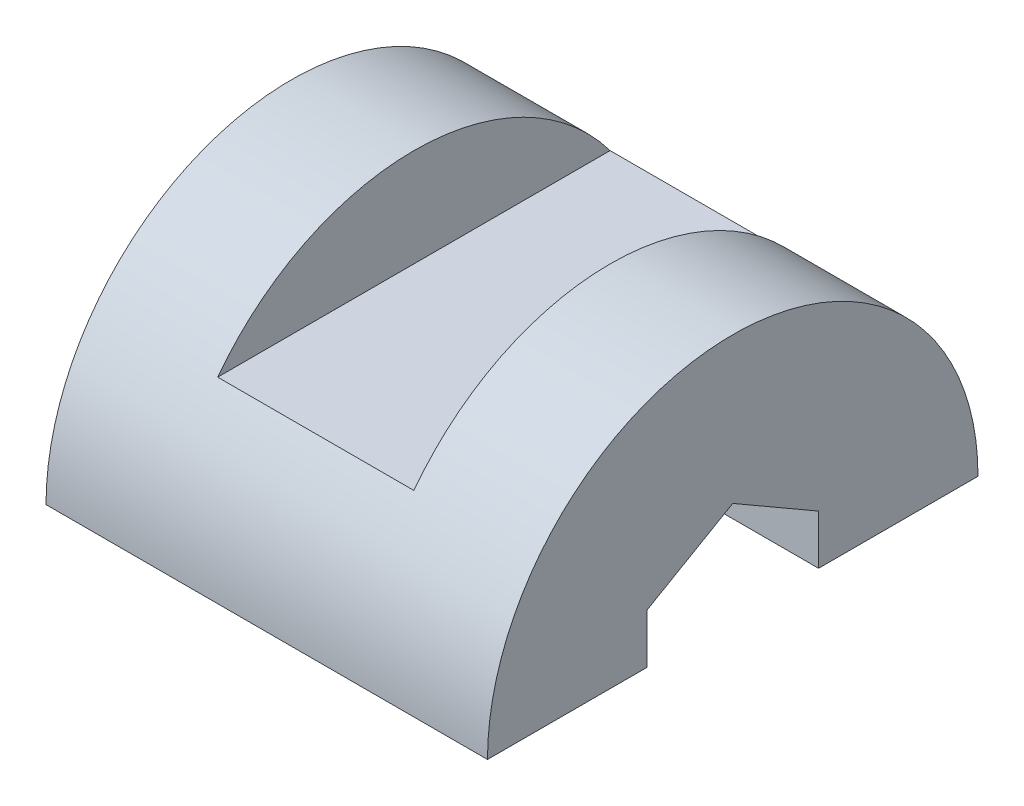
ISO-10303-21;
HEADER;
FILE_DESCRIPTION(('STEP AP214'),'2;1');
FILE_NAME('part.step','',(''),(''),'','','');
FILE_SCHEMA(('AUTOMOTIVE_DESIGN { 1 0 10303 214 1 1 1 1 }'));
ENDSEC;
DATA;
#1=APPLICATION_CONTEXT('core data for automotive mechanical design processes');
#2=APPLICATION_PROTOCOL_DEFINITION('international standard','automotive_design',2000,#1);
#3=PRODUCT_CONTEXT('',#1,'mechanical');
#4=PRODUCT('Part','Part','',(#3));
#5=PRODUCT_RELATED_PRODUCT_CATEGORY('part','',(#4));
#6=PRODUCT_DEFINITION_FORMATION('','',#4);
#7=PRODUCT_DEFINITION_CONTEXT('part definition',#1,'design');
#8=PRODUCT_DEFINITION('design','',#6,#7);
#9=PRODUCT_DEFINITION_SHAPE('','',#8);
#10=(LENGTH_UNIT() NAMED_UNIT(*) SI_UNIT(.MILLI.,.METRE.));
#11=(NAMED_UNIT(*) PLANE_ANGLE_UNIT() SI_UNIT($,.RADIAN.));
#12=(NAMED_UNIT(*) SI_UNIT($,.STERADIAN.) SOLID_ANGLE_UNIT());
#13=UNCERTAINTY_MEASURE_WITH_UNIT(LENGTH_MEASURE(1.E-05),#10,'distance_accuracy_value','');
#14=(GEOMETRIC_REPRESENTATION_CONTEXT(3) GLOBAL_UNCERTAINTY_ASSIGNED_CONTEXT((#13)) GLOBAL_UNIT_ASSIGNED_CONTEXT((#10,
#11,#12)) REPRESENTATION_CONTEXT('',''));
#15=CARTESIAN_POINT('',(0.,0.,0.));
#16=DIRECTION('',(0.,0.,1.));
#17=DIRECTION('',(1.,0.,0.));
#18=AXIS2_PLACEMENT_3D('',#15,#16,#17);
#19=CARTESIAN_POINT('',(90.,0.,0.));
#20=DIRECTION('',(-1.,0.,0.));
#21=DIRECTION('',(0.,0.,1.));
#22=AXIS2_PLACEMENT_3D('',#19,#20,#21);
#23=CYLINDRICAL_SURFACE('',#22,50.);
#24=CARTESIAN_POINT('',(0.,0.,0.));
#25=DIRECTION('',(1.,0.,0.));
#26=DIRECTION('',(0.,0.,-1.));
#27=AXIS2_PLACEMENT_3D('',#24,#25,#26);
#28=CIRCLE('',#27,50.);
#29=CARTESIAN_POINT('',(0.,0.,-50.));
#30=VERTEX_POINT('',#29);
#31=CARTESIAN_POINT('',(0.,0.,50.));
#32=VERTEX_POINT('',#31);
#33=EDGE_CURVE('E153',#30,#32,#28,.T.);
#34=ORIENTED_EDGE('',*,*,#33,.T.);
#35=DIRECTION('',(-1.,0.,0.));
#36=VECTOR('',#35,1.);
#37=CARTESIAN_POINT('',(90.,0.,50.));
#38=LINE('',#37,#36);
#39=CARTESIAN_POINT('',(90.,0.,50.));
#40=VERTEX_POINT('',#39);
#41=EDGE_CURVE('E11',#40,#32,#38,.T.);
#42=ORIENTED_EDGE('',*,*,#41,.F.);
#43=CARTESIAN_POINT('',(90.,0.,0.));
#44=DIRECTION('',(1.,0.,0.));
#45=DIRECTION('',(0.,0.,-1.));
#46=AXIS2_PLACEMENT_3D('',#43,#44,#45);
#47=CIRCLE('',#46,50.);
#48=CARTESIAN_POINT('',(90.,0.,-50.));
#49=VERTEX_POINT('',#48);
#50=EDGE_CURVE('E154',#49,#40,#47,.T.);
#51=ORIENTED_EDGE('',*,*,#50,.F.);
#52=DIRECTION('',(-1.,0.,0.));
#53=VECTOR('',#52,1.);
#54=CARTESIAN_POINT('',(90.,0.,-50.));
#55=LINE('',#54,#53);
#56=EDGE_CURVE('E40',#49,#30,#55,.T.);
#57=ORIENTED_EDGE('',*,*,#56,.T.);
#58=EDGE_LOOP('',(#34,#42,#51,#57));
#59=FACE_BOUND('',#58,.T.);
#60=CARTESIAN_POINT('',(25.,0.,0.));
#61=DIRECTION('',(1.,0.,0.));
#62=DIRECTION('',(0.,1.,0.));
#63=AXIS2_PLACEMENT_3D('',#60,#61,#62);
#64=CIRCLE('',#63,50.);
#65=CARTESIAN_POINT('',(25.,30.,40.));
#66=VERTEX_POINT('',#65);
#67=CARTESIAN_POINT('',(25.,30.,-40.));
#68=VERTEX_POINT('',#67);
#69=EDGE_CURVE('E107',#66,#68,#64,.F.);
#70=ORIENTED_EDGE('',*,*,#69,.T.);
#71=DIRECTION('',(-1.,0.,0.));
#72=VECTOR('',#71,1.);
#73=CARTESIAN_POINT('',(90.,30.,-40.));
#74=LINE('',#73,#72);
#75=CARTESIAN_POINT('',(65.,30.,-40.));
#76=VERTEX_POINT('',#75);
#77=EDGE_CURVE('E112',#76,#68,#74,.T.);
#78=ORIENTED_EDGE('',*,*,#77,.F.);
#79=CARTESIAN_POINT('',(65.,0.,0.));
#80=DIRECTION('',(-1.,0.,0.));
#81=DIRECTION('',(0.,0.,1.));
#82=AXIS2_PLACEMENT_3D('',#79,#80,#81);
#83=CIRCLE('',#82,50.);
#84=CARTESIAN_POINT('',(65.,30.,40.));
#85=VERTEX_POINT('',#84);
#86=EDGE_CURVE('E116',#76,#85,#83,.F.);
#87=ORIENTED_EDGE('',*,*,#86,.T.);
#88=DIRECTION('',(-1.,0.,0.));
#89=VECTOR('',#88,1.);
#90=CARTESIAN_POINT('',(90.,30.,40.));
#91=LINE('',#90,#89);
#92=EDGE_CURVE('E47',#85,#66,#91,.T.);
#93=ORIENTED_EDGE('',*,*,#92,.T.);
#94=EDGE_LOOP('',(#70,#78,#87,#93));
#95=FACE_BOUND('',#94,.T.);
#96=ADVANCED_FACE('F33',(#59,#95),#23,.T.);
#97=CARTESIAN_POINT('',(90.,0.,50.));
#98=DIRECTION('',(0.,1.,0.));
#99=DIRECTION('',(0.,0.,1.));
#100=AXIS2_PLACEMENT_3D('',#97,#98,#99);
#101=PLANE('',#100);
#102=DIRECTION('',(0.,0.,-1.));
#103=VECTOR('',#102,1.);
#104=CARTESIAN_POINT('',(0.,0.,50.));
#105=LINE('',#104,#103);
#106=CARTESIAN_POINT('',(0.,0.,17.5));
#107=VERTEX_POINT('',#106);
#108=EDGE_CURVE('E158',#32,#107,#105,.T.);
#109=ORIENTED_EDGE('',*,*,#108,.T.);
#110=DIRECTION('',(-1.,0.,0.));
#111=VECTOR('',#110,1.);
#112=CARTESIAN_POINT('',(90.001,0.,17.5));
#113=LINE('',#112,#111);
#114=CARTESIAN_POINT('',(90.,0.,17.5));
#115=VERTEX_POINT('',#114);
#116=EDGE_CURVE('E124',#115,#107,#113,.T.);
#117=ORIENTED_EDGE('',*,*,#116,.F.);
#118=DIRECTION('',(0.,0.,-1.));
#119=VECTOR('',#118,1.);
#120=CARTESIAN_POINT('',(90.,0.,50.));
#121=LINE('',#120,#119);
#122=EDGE_CURVE('E159',#40,#115,#121,.T.);
#123=ORIENTED_EDGE('',*,*,#122,.F.);
#124=ORIENTED_EDGE('',*,*,#41,.T.);
#125=EDGE_LOOP('',(#109,#117,#123,#124));
#126=FACE_BOUND('',#125,.T.);
#127=ADVANCED_FACE('F181',(#126),#101,.F.);
#128=CARTESIAN_POINT('',(90.,0.,-17.5));
#129=VERTEX_POINT('',#128);
#130=EDGE_CURVE('E157',#129,#49,#121,.T.);
#131=ORIENTED_EDGE('',*,*,#130,.F.);
#132=DIRECTION('',(1.,0.,0.));
#133=VECTOR('',#132,1.);
#134=CARTESIAN_POINT('',(90.001,0.,-17.5));
#135=LINE('',#134,#133);
#136=CARTESIAN_POINT('',(0.,0.,-17.5));
#137=VERTEX_POINT('',#136);
#138=EDGE_CURVE('E108',#137,#129,#135,.T.);
#139=ORIENTED_EDGE('',*,*,#138,.F.);
#140=EDGE_CURVE('E164',#137,#30,#105,.T.);
#141=ORIENTED_EDGE('',*,*,#140,.T.);
#142=ORIENTED_EDGE('',*,*,#56,.F.);
#143=EDGE_LOOP('',(#131,#139,#141,#142));
#144=FACE_BOUND('',#143,.T.);
#145=ADVANCED_FACE('F186',(#144),#101,.F.);
#146=CARTESIAN_POINT('',(90.,0.,0.));
#147=DIRECTION('',(1.,0.,0.));
#148=DIRECTION('',(0.,0.,-1.));
#149=AXIS2_PLACEMENT_3D('',#146,#147,#148);
#150=PLANE('',#149);
#151=DIRECTION('',(0.,1.,0.));
#152=VECTOR('',#151,1.);
#153=CARTESIAN_POINT('',(90.,-10.1036297108185,17.5));
#154=LINE('',#153,#152);
#155=CARTESIAN_POINT('',(90.,10.1036297108185,17.5));
#156=VERTEX_POINT('',#155);
#157=EDGE_CURVE('E132',#115,#156,#154,.T.);
#158=ORIENTED_EDGE('',*,*,#157,.T.);
#159=DIRECTION('',(0.,0.5,-0.866025403784439));
#160=VECTOR('',#159,1.);
#161=CARTESIAN_POINT('',(90.,10.1036297108185,17.5));
#162=LINE('',#161,#160);
#163=CARTESIAN_POINT('',(90.,20.2072594216369,0.));
#164=VERTEX_POINT('',#163);
#165=EDGE_CURVE('E129',#156,#164,#162,.T.);
#166=ORIENTED_EDGE('',*,*,#165,.T.);
#167=DIRECTION('',(0.,-0.5,-0.866025403784439));
#168=VECTOR('',#167,1.);
#169=CARTESIAN_POINT('',(90.,20.2072594216369,0.));
#170=LINE('',#169,#168);
#171=CARTESIAN_POINT('',(90.,10.1036297108185,-17.5));
#172=VERTEX_POINT('',#171);
#173=EDGE_CURVE('E147',#164,#172,#170,.T.);
#174=ORIENTED_EDGE('',*,*,#173,.T.);
#175=DIRECTION('',(0.,-1.,0.));
#176=VECTOR('',#175,1.);
#177=CARTESIAN_POINT('',(90.,10.1036297108185,-17.5));
#178=LINE('',#177,#176);
#179=EDGE_CURVE('E126',#172,#129,#178,.T.);
#180=ORIENTED_EDGE('',*,*,#179,.T.);
#181=ORIENTED_EDGE('',*,*,#130,.T.);
#182=ORIENTED_EDGE('',*,*,#50,.T.);
#183=ORIENTED_EDGE('',*,*,#122,.T.);
#184=EDGE_LOOP('',(#158,#166,#174,#180,#181,#182,#183));
#185=FACE_BOUND('',#184,.T.);
#186=ADVANCED_FACE('F183',(#185),#150,.T.);
#187=CARTESIAN_POINT('',(0.,0.,0.));
#188=DIRECTION('',(1.,0.,0.));
#189=DIRECTION('',(0.,0.,-1.));
#190=AXIS2_PLACEMENT_3D('',#187,#188,#189);
#191=PLANE('',#190);
#192=DIRECTION('',(0.,0.5,-0.866025403784439));
#193=VECTOR('',#192,1.);
#194=CARTESIAN_POINT('',(0.,10.1036297108185,17.5));
#195=LINE('',#194,#193);
#196=CARTESIAN_POINT('',(0.,10.1036297108185,17.5));
#197=VERTEX_POINT('',#196);
#198=CARTESIAN_POINT('',(0.,20.2072594216369,0.));
#199=VERTEX_POINT('',#198);
#200=EDGE_CURVE('E55',#197,#199,#195,.T.);
#201=ORIENTED_EDGE('',*,*,#200,.F.);
#202=DIRECTION('',(0.,1.,0.));
#203=VECTOR('',#202,1.);
#204=CARTESIAN_POINT('',(0.,-10.1036297108185,17.5));
#205=LINE('',#204,#203);
#206=EDGE_CURVE('E141',#107,#197,#205,.T.);
#207=ORIENTED_EDGE('',*,*,#206,.F.);
#208=ORIENTED_EDGE('',*,*,#108,.F.);
#209=ORIENTED_EDGE('',*,*,#33,.F.);
#210=ORIENTED_EDGE('',*,*,#140,.F.);
#211=DIRECTION('',(0.,-1.,0.));
#212=VECTOR('',#211,1.);
#213=CARTESIAN_POINT('',(0.,10.1036297108185,-17.5));
#214=LINE('',#213,#212);
#215=CARTESIAN_POINT('',(0.,10.1036297108185,-17.5));
#216=VERTEX_POINT('',#215);
#217=EDGE_CURVE('E139',#216,#137,#214,.T.);
#218=ORIENTED_EDGE('',*,*,#217,.F.);
#219=DIRECTION('',(0.,-0.5,-0.866025403784439));
#220=VECTOR('',#219,1.);
#221=CARTESIAN_POINT('',(0.,20.2072594216369,0.));
#222=LINE('',#221,#220);
#223=EDGE_CURVE('E136',#199,#216,#222,.T.);
#224=ORIENTED_EDGE('',*,*,#223,.F.);
#225=EDGE_LOOP('',(#201,#207,#208,#209,#210,#218,#224));
#226=FACE_BOUND('',#225,.T.);
#227=ADVANCED_FACE('F176',(#226),#191,.F.);
#228=CARTESIAN_POINT('',(90.001,-10.1036297108185,17.5));
#229=DIRECTION('',(0.,0.,1.));
#230=DIRECTION('',(1.,0.,0.));
#231=AXIS2_PLACEMENT_3D('',#228,#229,#230);
#232=PLANE('',#231);
#233=ORIENTED_EDGE('',*,*,#116,.T.);
#234=ORIENTED_EDGE('',*,*,#206,.T.);
#235=DIRECTION('',(-1.,0.,0.));
#236=VECTOR('',#235,1.);
#237=CARTESIAN_POINT('',(90.001,10.1036297108185,17.5));
#238=LINE('',#237,#236);
#239=EDGE_CURVE('E145',#156,#197,#238,.T.);
#240=ORIENTED_EDGE('',*,*,#239,.F.);
#241=ORIENTED_EDGE('',*,*,#157,.F.);
#242=EDGE_LOOP('',(#233,#234,#240,#241));
#243=FACE_BOUND('',#242,.T.);
#244=ADVANCED_FACE('F196',(#243),#232,.F.);
#245=CARTESIAN_POINT('',(90.001,10.1036297108185,-17.5));
#246=DIRECTION('',(0.,0.,-1.));
#247=DIRECTION('',(-1.,0.,0.));
#248=AXIS2_PLACEMENT_3D('',#245,#246,#247);
#249=PLANE('',#248);
#250=ORIENTED_EDGE('',*,*,#138,.T.);
#251=ORIENTED_EDGE('',*,*,#179,.F.);
#252=DIRECTION('',(-1.,0.,0.));
#253=VECTOR('',#252,1.);
#254=CARTESIAN_POINT('',(90.001,10.1036297108185,-17.5));
#255=LINE('',#254,#253);
#256=EDGE_CURVE('E148',#172,#216,#255,.T.);
#257=ORIENTED_EDGE('',*,*,#256,.T.);
#258=ORIENTED_EDGE('',*,*,#217,.T.);
#259=EDGE_LOOP('',(#250,#251,#257,#258));
#260=FACE_BOUND('',#259,.T.);
#261=ADVANCED_FACE('F188',(#260),#249,.F.);
#262=CARTESIAN_POINT('',(90.001,10.1036297108185,17.5));
#263=DIRECTION('',(0.,0.866025403784439,0.5));
#264=DIRECTION('',(0.,-0.5,0.866025403784439));
#265=AXIS2_PLACEMENT_3D('',#262,#263,#264);
#266=PLANE('',#265);
#267=ORIENTED_EDGE('',*,*,#239,.T.);
#268=ORIENTED_EDGE('',*,*,#200,.T.);
#269=DIRECTION('',(-1.,0.,0.));
#270=VECTOR('',#269,1.);
#271=CARTESIAN_POINT('',(90.001,20.2072594216369,0.));
#272=LINE('',#271,#270);
#273=EDGE_CURVE('E144',#164,#199,#272,.T.);
#274=ORIENTED_EDGE('',*,*,#273,.F.);
#275=ORIENTED_EDGE('',*,*,#165,.F.);
#276=EDGE_LOOP('',(#267,#268,#274,#275));
#277=FACE_BOUND('',#276,.T.);
#278=ADVANCED_FACE('F194',(#277),#266,.F.);
#279=CARTESIAN_POINT('',(90.001,20.2072594216369,0.));
#280=DIRECTION('',(0.,0.866025403784439,-0.5));
#281=DIRECTION('',(0.,0.5,0.866025403784439));
#282=AXIS2_PLACEMENT_3D('',#279,#280,#281);
#283=PLANE('',#282);
#284=ORIENTED_EDGE('',*,*,#273,.T.);
#285=ORIENTED_EDGE('',*,*,#223,.T.);
#286=ORIENTED_EDGE('',*,*,#256,.F.);
#287=ORIENTED_EDGE('',*,*,#173,.F.);
#288=EDGE_LOOP('',(#284,#285,#286,#287));
#289=FACE_BOUND('',#288,.T.);
#290=ADVANCED_FACE('F191',(#289),#283,.F.);
#291=CARTESIAN_POINT('',(25.,50.,50.001));
#292=DIRECTION('',(1.,0.,0.));
#293=DIRECTION('',(0.,1.,0.));
#294=AXIS2_PLACEMENT_3D('',#291,#292,#293);
#295=PLANE('',#294);
#296=DIRECTION('',(0.,0.,-1.));
#297=VECTOR('',#296,1.);
#298=CARTESIAN_POINT('',(25.,30.,50.001));
#299=LINE('',#298,#297);
#300=EDGE_CURVE('E103',#66,#68,#299,.T.);
#301=ORIENTED_EDGE('',*,*,#300,.T.);
#302=ORIENTED_EDGE('',*,*,#69,.F.);
#303=EDGE_LOOP('',(#301,#302));
#304=FACE_BOUND('',#303,.T.);
#305=ADVANCED_FACE('F105',(#304),#295,.T.);
#306=CARTESIAN_POINT('',(25.,30.,50.001));
#307=DIRECTION('',(0.,1.,0.));
#308=DIRECTION('',(0.,0.,1.));
#309=AXIS2_PLACEMENT_3D('',#306,#307,#308);
#310=PLANE('',#309);
#311=DIRECTION('',(0.,0.,-1.));
#312=VECTOR('',#311,1.);
#313=CARTESIAN_POINT('',(65.,30.,50.001));
#314=LINE('',#313,#312);
#315=EDGE_CURVE('E109',#85,#76,#314,.T.);
#316=ORIENTED_EDGE('',*,*,#315,.T.);
#317=ORIENTED_EDGE('',*,*,#77,.T.);
#318=ORIENTED_EDGE('',*,*,#300,.F.);
#319=ORIENTED_EDGE('',*,*,#92,.F.);
#320=EDGE_LOOP('',(#316,#317,#318,#319));
#321=FACE_BOUND('',#320,.T.);
#322=ADVANCED_FACE('F113',(#321),#310,.T.);
#323=CARTESIAN_POINT('',(65.,30.,50.001));
#324=DIRECTION('',(-1.,0.,0.));
#325=DIRECTION('',(0.,0.,1.));
#326=AXIS2_PLACEMENT_3D('',#323,#324,#325);
#327=PLANE('',#326);
#328=ORIENTED_EDGE('',*,*,#315,.F.);
#329=ORIENTED_EDGE('',*,*,#86,.F.);
#330=EDGE_LOOP('',(#328,#329));
#331=FACE_BOUND('',#330,.T.);
#332=ADVANCED_FACE('F225',(#331),#327,.T.);
#333=CLOSED_SHELL('',(#96,#127,#145,#186,#227,#244,#261,#278,#290,#305,#322,#332));
#334=MANIFOLD_SOLID_BREP('B2',#333);
#335=ADVANCED_BREP_SHAPE_REPRESENTATION('',(#18,#334),#14);
#336=SHAPE_DEFINITION_REPRESENTATION(#9,#335);
ENDSEC;
END-ISO-10303-21;
